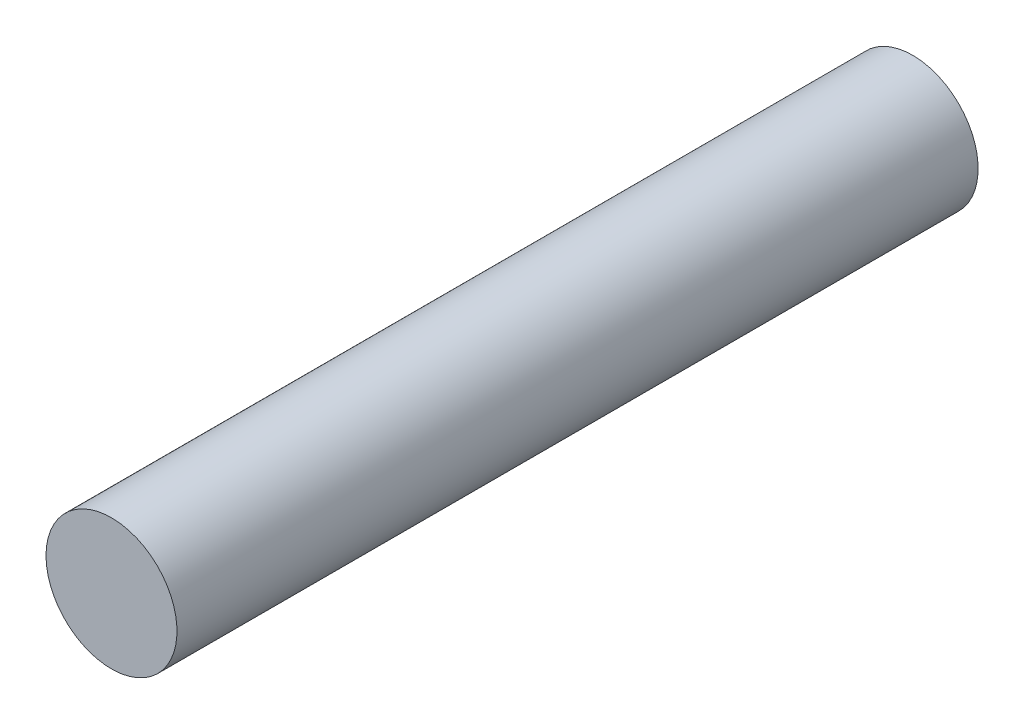
ISO-10303-21;
HEADER;
FILE_DESCRIPTION(('STEP AP214'),'2;1');
FILE_NAME('part.step','',(''),(''),'','','');
FILE_SCHEMA(('AUTOMOTIVE_DESIGN { 1 0 10303 214 1 1 1 1 }'));
ENDSEC;
DATA;
#1=APPLICATION_CONTEXT('core data for automotive mechanical design processes');
#2=APPLICATION_PROTOCOL_DEFINITION('international standard','automotive_design',2000,#1);
#3=PRODUCT_CONTEXT('',#1,'mechanical');
#4=PRODUCT('Part','Part','',(#3));
#5=PRODUCT_RELATED_PRODUCT_CATEGORY('part','',(#4));
#6=PRODUCT_DEFINITION_FORMATION('','',#4);
#7=PRODUCT_DEFINITION_CONTEXT('part definition',#1,'design');
#8=PRODUCT_DEFINITION('design','',#6,#7);
#9=PRODUCT_DEFINITION_SHAPE('','',#8);
#10=(LENGTH_UNIT() NAMED_UNIT(*) SI_UNIT(.MILLI.,.METRE.));
#11=(NAMED_UNIT(*) PLANE_ANGLE_UNIT() SI_UNIT($,.RADIAN.));
#12=(NAMED_UNIT(*) SI_UNIT($,.STERADIAN.) SOLID_ANGLE_UNIT());
#13=UNCERTAINTY_MEASURE_WITH_UNIT(LENGTH_MEASURE(1.E-05),#10,'distance_accuracy_value','');
#14=(GEOMETRIC_REPRESENTATION_CONTEXT(3) GLOBAL_UNCERTAINTY_ASSIGNED_CONTEXT((#13)) GLOBAL_UNIT_ASSIGNED_CONTEXT((#10,
#11,#12)) REPRESENTATION_CONTEXT('',''));
#15=CARTESIAN_POINT('',(0.,0.,0.));
#16=DIRECTION('',(0.,0.,1.));
#17=DIRECTION('',(1.,0.,0.));
#18=AXIS2_PLACEMENT_3D('',#15,#16,#17);
#19=CARTESIAN_POINT('',(0.,0.,26.416));
#20=DIRECTION('',(0.,0.,-1.));
#21=DIRECTION('',(-1.,0.,0.));
#22=AXIS2_PLACEMENT_3D('',#19,#20,#21);
#23=CYLINDRICAL_SURFACE('',#22,2.159);
#24=CARTESIAN_POINT('',(0.,0.,26.416));
#25=DIRECTION('',(0.,0.,1.));
#26=DIRECTION('',(1.,0.,0.));
#27=AXIS2_PLACEMENT_3D('',#24,#25,#26);
#28=CIRCLE('',#27,2.159);
#29=CARTESIAN_POINT('',(-2.159,0.,26.416));
#30=VERTEX_POINT('',#29);
#31=EDGE_CURVE('E10',#30,#30,#28,.T.);
#32=CARTESIAN_POINT('',(0.,0.,0.));
#33=DIRECTION('',(0.,0.,1.));
#34=DIRECTION('',(1.,0.,0.));
#35=AXIS2_PLACEMENT_3D('',#32,#33,#34);
#36=CIRCLE('',#35,2.159);
#37=CARTESIAN_POINT('',(-2.159,0.,0.));
#38=VERTEX_POINT('',#37);
#39=EDGE_CURVE('E40',#38,#38,#36,.T.);
#40=CARTESIAN_POINT('',(-2.159,0.,26.416));
#41=CARTESIAN_POINT('',(-2.159,0.,26.1408333333333));
#42=CARTESIAN_POINT('',(-2.159,0.,25.8656666666667));
#43=CARTESIAN_POINT('',(-2.159,0.,25.3153333333333));
#44=CARTESIAN_POINT('',(-2.159,0.,25.0401666666667));
#45=CARTESIAN_POINT('',(-2.159,0.,24.4898333333333));
#46=CARTESIAN_POINT('',(-2.159,0.,24.2146666666667));
#47=CARTESIAN_POINT('',(-2.159,0.,23.6643333333333));
#48=CARTESIAN_POINT('',(-2.159,0.,23.3891666666667));
#49=CARTESIAN_POINT('',(-2.159,0.,22.8388333333333));
#50=CARTESIAN_POINT('',(-2.159,0.,22.5636666666667));
#51=CARTESIAN_POINT('',(-2.159,0.,22.0133333333333));
#52=CARTESIAN_POINT('',(-2.159,0.,21.7381666666667));
#53=CARTESIAN_POINT('',(-2.159,0.,21.1878333333333));
#54=CARTESIAN_POINT('',(-2.159,0.,20.9126666666667));
#55=CARTESIAN_POINT('',(-2.159,0.,20.3623333333333));
#56=CARTESIAN_POINT('',(-2.159,0.,20.0871666666667));
#57=CARTESIAN_POINT('',(-2.159,0.,19.5368333333333));
#58=CARTESIAN_POINT('',(-2.159,0.,19.2616666666667));
#59=CARTESIAN_POINT('',(-2.159,0.,18.7113333333333));
#60=CARTESIAN_POINT('',(-2.159,0.,18.4361666666667));
#61=CARTESIAN_POINT('',(-2.159,0.,17.8858333333333));
#62=CARTESIAN_POINT('',(-2.159,0.,17.6106666666667));
#63=CARTESIAN_POINT('',(-2.159,0.,17.0603333333333));
#64=CARTESIAN_POINT('',(-2.159,0.,16.7851666666667));
#65=CARTESIAN_POINT('',(-2.159,0.,16.2348333333333));
#66=CARTESIAN_POINT('',(-2.159,0.,15.9596666666667));
#67=CARTESIAN_POINT('',(-2.159,0.,15.4093333333333));
#68=CARTESIAN_POINT('',(-2.159,0.,15.1341666666667));
#69=CARTESIAN_POINT('',(-2.159,0.,14.5838333333333));
#70=CARTESIAN_POINT('',(-2.159,0.,14.3086666666667));
#71=CARTESIAN_POINT('',(-2.159,0.,13.7583333333333));
#72=CARTESIAN_POINT('',(-2.159,0.,13.4831666666667));
#73=CARTESIAN_POINT('',(-2.159,0.,12.9328333333333));
#74=CARTESIAN_POINT('',(-2.159,0.,12.6576666666667));
#75=CARTESIAN_POINT('',(-2.159,0.,12.1073333333333));
#76=CARTESIAN_POINT('',(-2.159,0.,11.8321666666667));
#77=CARTESIAN_POINT('',(-2.159,0.,11.2818333333333));
#78=CARTESIAN_POINT('',(-2.159,0.,11.0066666666667));
#79=CARTESIAN_POINT('',(-2.159,0.,10.4563333333333));
#80=CARTESIAN_POINT('',(-2.159,0.,10.1811666666667));
#81=CARTESIAN_POINT('',(-2.159,0.,9.63083333333333));
#82=CARTESIAN_POINT('',(-2.159,0.,9.35566666666666));
#83=CARTESIAN_POINT('',(-2.159,0.,8.80533333333333));
#84=CARTESIAN_POINT('',(-2.159,0.,8.53016666666666));
#85=CARTESIAN_POINT('',(-2.159,0.,7.97983333333333));
#86=CARTESIAN_POINT('',(-2.159,0.,7.70466666666667));
#87=CARTESIAN_POINT('',(-2.159,0.,7.15433333333333));
#88=CARTESIAN_POINT('',(-2.159,0.,6.87916666666667));
#89=CARTESIAN_POINT('',(-2.159,0.,6.32883333333333));
#90=CARTESIAN_POINT('',(-2.159,0.,6.05366666666667));
#91=CARTESIAN_POINT('',(-2.159,0.,5.50333333333333));
#92=CARTESIAN_POINT('',(-2.159,0.,5.22816666666667));
#93=CARTESIAN_POINT('',(-2.159,0.,4.67783333333333));
#94=CARTESIAN_POINT('',(-2.159,0.,4.40266666666667));
#95=CARTESIAN_POINT('',(-2.159,0.,3.85233333333333));
#96=CARTESIAN_POINT('',(-2.159,0.,3.57716666666667));
#97=CARTESIAN_POINT('',(-2.159,0.,3.02683333333333));
#98=CARTESIAN_POINT('',(-2.159,0.,2.75166666666667));
#99=CARTESIAN_POINT('',(-2.159,0.,2.20133333333333));
#100=CARTESIAN_POINT('',(-2.159,0.,1.92616666666667));
#101=CARTESIAN_POINT('',(-2.159,0.,1.37583333333333));
#102=CARTESIAN_POINT('',(-2.159,0.,1.10066666666667));
#103=CARTESIAN_POINT('',(-2.159,0.,0.550333333333333));
#104=CARTESIAN_POINT('',(-2.159,0.,0.275166666666666));
#105=CARTESIAN_POINT('',(-2.159,0.,0.));
#106=B_SPLINE_CURVE_WITH_KNOTS('',3,(#40,#41,#42,#43,#44,#45,#46,#47,#48,#49,#50,#51,#52,#53,
#54,#55,#56,#57,#58,#59,#60,#61,#62,#63,#64,#65,#66,#67,#68,#69,#70,#71,#72,#73,#74,#75,#76,#77,
#78,#79,#80,#81,#82,#83,#84,#85,#86,#87,#88,#89,#90,#91,#92,#93,#94,#95,#96,#97,#98,#99,#100,
#101,#102,#103,#104,#105),.UNSPECIFIED.,.F.,.F.,(4,2,2,2,2,2,2,2,2,2,2,2,2,2,2,2,2,2,2,2,2,2,2,
2,2,2,2,2,2,2,2,2,4),(0.,0.8255,1.651,2.4765,3.302,4.1275,4.953,5.7785,6.604,7.4295,8.255,
9.0805,9.906,10.7315,11.557,12.3825,13.208,14.0335,14.859,15.6845,16.51,17.3355,18.161,18.9865,
19.812,20.6375,21.463,22.2885,23.114,23.9395,24.765,25.5905,26.416),.UNSPECIFIED.);
#107=EDGE_CURVE('BSEAM37',#30,#38,#106,.T.);
#108=ORIENTED_EDGE('',*,*,#31,.F.);
#109=ORIENTED_EDGE('',*,*,#39,.T.);
#110=ORIENTED_EDGE('',*,*,#107,.T.);
#111=ORIENTED_EDGE('',*,*,#107,.F.);
#112=EDGE_LOOP('',(#108,#110,#109,#111));
#113=FACE_BOUND('',#112,.T.);
#114=ADVANCED_FACE('F37',(#113),#23,.T.);
#115=CARTESIAN_POINT('',(0.,0.,26.416));
#116=DIRECTION('',(0.,0.,1.));
#117=DIRECTION('',(1.,0.,0.));
#118=AXIS2_PLACEMENT_3D('',#115,#116,#117);
#119=PLANE('',#118);
#120=ORIENTED_EDGE('',*,*,#31,.T.);
#121=EDGE_LOOP('',(#120));
#122=FACE_BOUND('',#121,.T.);
#123=ADVANCED_FACE('F56',(#122),#119,.T.);
#124=CARTESIAN_POINT('',(0.,0.,0.));
#125=DIRECTION('',(0.,0.,1.));
#126=DIRECTION('',(1.,0.,0.));
#127=AXIS2_PLACEMENT_3D('',#124,#125,#126);
#128=PLANE('',#127);
#129=ORIENTED_EDGE('',*,*,#39,.F.);
#130=EDGE_LOOP('',(#129));
#131=FACE_BOUND('',#130,.T.);
#132=ADVANCED_FACE('F54',(#131),#128,.F.);
#133=CLOSED_SHELL('',(#114,#123,#132));
#134=MANIFOLD_SOLID_BREP('B2',#133);
#135=ADVANCED_BREP_SHAPE_REPRESENTATION('',(#18,#134),#14);
#136=SHAPE_DEFINITION_REPRESENTATION(#9,#135);
ENDSEC;
END-ISO-10303-21;
